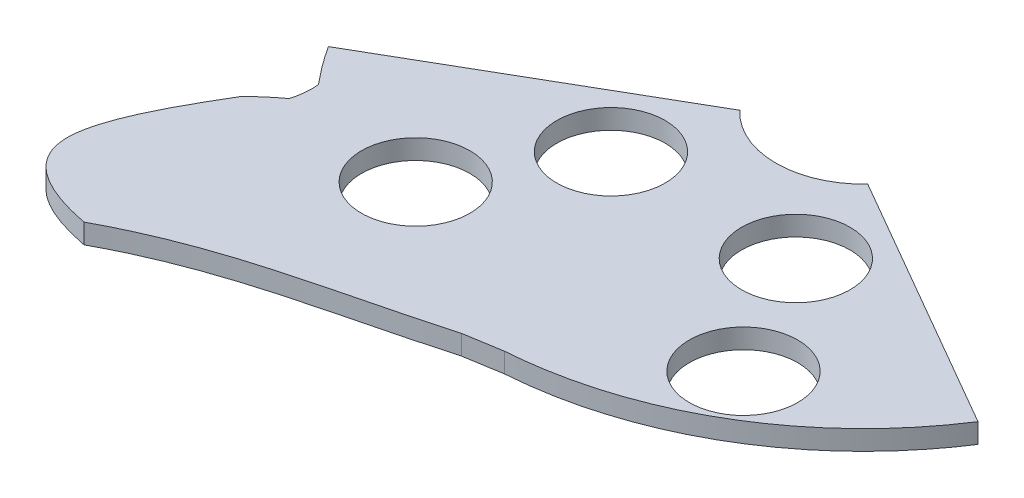
ISO-10303-21;
HEADER;
FILE_DESCRIPTION(('STEP AP214'),'2;1');
FILE_NAME('part.step','',(''),(''),'','','');
FILE_SCHEMA(('AUTOMOTIVE_DESIGN { 1 0 10303 214 1 1 1 1 }'));
ENDSEC;
DATA;
#1=APPLICATION_CONTEXT('core data for automotive mechanical design processes');
#2=APPLICATION_PROTOCOL_DEFINITION('international standard','automotive_design',2000,#1);
#3=PRODUCT_CONTEXT('',#1,'mechanical');
#4=PRODUCT('Part','Part','',(#3));
#5=PRODUCT_RELATED_PRODUCT_CATEGORY('part','',(#4));
#6=PRODUCT_DEFINITION_FORMATION('','',#4);
#7=PRODUCT_DEFINITION_CONTEXT('part definition',#1,'design');
#8=PRODUCT_DEFINITION('design','',#6,#7);
#9=PRODUCT_DEFINITION_SHAPE('','',#8);
#10=(LENGTH_UNIT() NAMED_UNIT(*) SI_UNIT(.MILLI.,.METRE.));
#11=(NAMED_UNIT(*) PLANE_ANGLE_UNIT() SI_UNIT($,.RADIAN.));
#12=(NAMED_UNIT(*) SI_UNIT($,.STERADIAN.) SOLID_ANGLE_UNIT());
#13=UNCERTAINTY_MEASURE_WITH_UNIT(LENGTH_MEASURE(1.E-05),#10,'distance_accuracy_value','');
#14=(GEOMETRIC_REPRESENTATION_CONTEXT(3) GLOBAL_UNCERTAINTY_ASSIGNED_CONTEXT((#13)) GLOBAL_UNIT_ASSIGNED_CONTEXT((#10,
#11,#12)) REPRESENTATION_CONTEXT('',''));
#15=CARTESIAN_POINT('',(0.,0.,0.));
#16=DIRECTION('',(0.,0.,1.));
#17=DIRECTION('',(1.,0.,0.));
#18=AXIS2_PLACEMENT_3D('',#15,#16,#17);
#19=CARTESIAN_POINT('',(-31.5137720928443,-111.736,87.2558514962642));
#20=DIRECTION('',(0.,1.,0.));
#21=DIRECTION('',(0.,0.,1.));
#22=AXIS2_PLACEMENT_3D('',#19,#20,#21);
#23=PLANE('',#22);
#24=CARTESIAN_POINT('',(18.75,-111.736,32.476));
#25=DIRECTION('',(0.,-1.,0.));
#26=DIRECTION('',(0.,0.,-1.));
#27=AXIS2_PLACEMENT_3D('',#24,#25,#26);
#28=CIRCLE('',#27,10.999845998306);
#29=CARTESIAN_POINT('',(18.75,-111.736,21.476154001694));
#30=VERTEX_POINT('',#29);
#31=EDGE_CURVE('E445',#30,#30,#28,.T.);
#32=ORIENTED_EDGE('',*,*,#31,.F.);
#33=EDGE_LOOP('',(#32));
#34=FACE_BOUND('',#33,.T.);
#35=CARTESIAN_POINT('',(-33.25,-111.736,57.591));
#36=DIRECTION('',(0.,-1.,0.));
#37=DIRECTION('',(0.,0.,-1.));
#38=AXIS2_PLACEMENT_3D('',#35,#36,#37);
#39=CIRCLE('',#38,10.999845998306);
#40=CARTESIAN_POINT('',(-33.25,-111.736,46.591154001694));
#41=VERTEX_POINT('',#40);
#42=EDGE_CURVE('E428',#41,#41,#39,.T.);
#43=ORIENTED_EDGE('',*,*,#42,.F.);
#44=EDGE_LOOP('',(#43));
#45=FACE_BOUND('',#44,.T.);
#46=CARTESIAN_POINT('',(-2.03178119647454,-111.736,79.545679459973));
#47=CARTESIAN_POINT('',(-2.21748719741889,-111.736,79.5981103006328));
#48=CARTESIAN_POINT('',(-5.88441218076331,-111.736,80.6334024211648));
#49=CARTESIAN_POINT('',(-13.0706280805937,-111.736,82.5176595693309));
#50=CARTESIAN_POINT('',(-21.8487370086499,-111.736,84.6919168837417));
#51=CARTESIAN_POINT('',(-28.8502610507126,-111.736,86.5095735267082));
#52=CARTESIAN_POINT('',(-35.8613399062389,-111.736,88.4602520867528));
#53=CARTESIAN_POINT('',(-44.4693251160133,-111.736,91.2316574917693));
#54=CARTESIAN_POINT('',(-51.7866983168984,-111.736,94.2596685314863));
#55=CARTESIAN_POINT('',(-56.2223618589842,-111.736,96.4025313891803));
#56=CARTESIAN_POINT('',(-58.0469637209967,-111.736,97.3224530072907));
#57=CARTESIAN_POINT('',(-59.252016923761,-111.736,97.9655333368525));
#58=CARTESIAN_POINT('',(-59.8561994001059,-111.736,98.2879571643748));
#59=B_SPLINE_CURVE_WITH_KNOTS('',3,(#46,#47,#48,#49,#50,#51,#52,#53,#54,#55,#56,#57,#58),
.UNSPECIFIED.,.F.,.F.,(4,1,1,1,1,1,1,1,1,1,4),(0.,0.00949811358191713,0.187548435759016,
0.365628289866562,0.454638288573253,0.543587017399176,0.723822200410255,0.899429959715416,
0.932769275994163,0.966292255625618,1.),.UNSPECIFIED.);
#60=CARTESIAN_POINT('',(-2.0317801757311,-111.736,79.5456855393009));
#61=VERTEX_POINT('',#60);
#62=CARTESIAN_POINT('',(-59.8559890898672,-111.736,98.2878449316723));
#63=VERTEX_POINT('',#62);
#64=EDGE_CURVE('E401',#61,#63,#59,.T.);
#65=ORIENTED_EDGE('',*,*,#64,.T.);
#66=DIRECTION('',(-0.994721215485722,0.,0.102614343357094));
#67=VECTOR('',#66,1.);
#68=CARTESIAN_POINT('',(-59.8559890898672,-111.736,98.2878449316723));
#69=LINE('',#68,#67);
#70=CARTESIAN_POINT('',(-59.8565013834733,-111.736,98.2878977793156));
#71=VERTEX_POINT('',#70);
#72=EDGE_CURVE('E107',#63,#71,#69,.T.);
#73=ORIENTED_EDGE('',*,*,#72,.T.);
#74=CARTESIAN_POINT('',(-59.8565013834733,-111.736,98.2878977793156));
#75=CARTESIAN_POINT('',(-69.5300759499468,-111.736,96.3855636719906));
#76=CARTESIAN_POINT('',(-82.0104942647189,-111.736,89.2819037680634));
#77=CARTESIAN_POINT('',(-71.8491297807287,-111.736,70.0999187205672));
#78=CARTESIAN_POINT('',(-65.949111027132,-111.736,60.2198328441974));
#79=B_SPLINE_CURVE_WITH_KNOTS('',3,(#74,#75,#76,#77,#78),.UNSPECIFIED.,.F.,.F.,(4,1,4),(0.,
0.510753583597468,0.999999863466676),.UNSPECIFIED.);
#80=CARTESIAN_POINT('',(-65.949111027132,-111.736,60.2198328441974));
#81=VERTEX_POINT('',#80);
#82=EDGE_CURVE('E399',#71,#81,#79,.T.);
#83=ORIENTED_EDGE('',*,*,#82,.T.);
#84=CARTESIAN_POINT('',(-60.7670507231847,-111.736,55.7993207475516));
#85=CARTESIAN_POINT('',(-61.1099981350749,-111.736,56.0543698082114));
#86=CARTESIAN_POINT('',(-61.7971175607158,-111.736,56.5653786626155));
#87=CARTESIAN_POINT('',(-62.8018008501687,-111.736,57.3701561377738));
#88=CARTESIAN_POINT('',(-63.7891526191819,-111.736,58.2046519762193));
#89=CARTESIAN_POINT('',(-64.756712262598,-111.736,59.0721119376626));
#90=CARTESIAN_POINT('',(-65.4723523378211,-111.736,59.7498811111553));
#91=CARTESIAN_POINT('',(-65.8658361237893,-111.736,60.1377497125325));
#92=CARTESIAN_POINT('',(-65.9491159666621,-111.736,60.2198411158632));
#93=B_SPLINE_CURVE_WITH_KNOTS('',3,(#84,#85,#86,#87,#88,#89,#90,#91,#92),.UNSPECIFIED.,.F.,.F.,
(4,1,1,1,1,1,4),(0.,0.188058136499834,0.376787793868092,0.566339482208077,0.756870107881908,
0.94854217648776,1.),.UNSPECIFIED.);
#94=CARTESIAN_POINT('',(-60.7670507231847,-111.736,55.7993207475516));
#95=VERTEX_POINT('',#94);
#96=EDGE_CURVE('E336',#81,#95,#93,.F.);
#97=ORIENTED_EDGE('',*,*,#96,.T.);
#98=CARTESIAN_POINT('',(-60.2526206276826,-111.736,50.3181152033262));
#99=CARTESIAN_POINT('',(-60.240013672135,-111.736,50.4081722730157));
#100=CARTESIAN_POINT('',(-60.2147906237152,-111.736,50.5883516843542));
#101=CARTESIAN_POINT('',(-60.1866124812174,-111.736,50.8599689495696));
#102=CARTESIAN_POINT('',(-60.165372634796,-111.736,51.13249486048));
#103=CARTESIAN_POINT('',(-60.1516800941592,-111.736,51.4059442823338));
#104=CARTESIAN_POINT('',(-60.1419651042944,-111.736,51.8168549668867));
#105=CARTESIAN_POINT('',(-60.1541756677885,-111.736,52.3769119912213));
#106=CARTESIAN_POINT('',(-60.2096955753526,-111.736,53.0783120507864));
#107=CARTESIAN_POINT('',(-60.2981504307189,-111.736,53.7817567736869));
#108=CARTESIAN_POINT('',(-60.3962077373735,-111.736,54.3632771993052));
#109=CARTESIAN_POINT('',(-60.4903974136492,-111.736,54.8216435952897));
#110=CARTESIAN_POINT('',(-60.5707429074705,-111.736,55.1589713768373));
#111=CARTESIAN_POINT('',(-60.6603563375182,-111.736,55.4833107698183));
#112=CARTESIAN_POINT('',(-60.7317267183386,-111.736,55.6946948171803));
#113=CARTESIAN_POINT('',(-60.7670516250781,-111.736,55.7993197564541));
#114=B_SPLINE_CURVE_WITH_KNOTS('',3,(#98,#99,#100,#101,#102,#103,#104,#105,#106,#107,#108,#109,
#110,#111,#112,#113),.UNSPECIFIED.,.F.,.F.,(4,1,1,1,1,1,1,1,1,1,1,1,1,4),(0.,0.0491530891513535,
0.09834180369512,0.147585269600685,0.196903783628035,0.24632380770677,0.369750821215096,
0.499511892559201,0.626495621441943,0.752891677292637,0.818190860638879,0.879415953268396,
0.940316695019687,1.),.UNSPECIFIED.);
#115=CARTESIAN_POINT('',(-60.2526206276826,-111.736,50.3181152033262));
#116=VERTEX_POINT('',#115);
#117=EDGE_CURVE('E395',#95,#116,#114,.F.);
#118=ORIENTED_EDGE('',*,*,#117,.T.);
#119=CARTESIAN_POINT('',(-65.8942438215736,-111.736,42.6629141284688));
#120=CARTESIAN_POINT('',(-64.1696780269507,-111.736,45.3256104245312));
#121=CARTESIAN_POINT('',(-62.2853732618695,-111.736,47.8843448713594));
#122=CARTESIAN_POINT('',(-60.2526206276826,-111.736,50.3181152033262));
#123=B_SPLINE_CURVE_WITH_KNOTS('',3,(#119,#120,#121,#122),.UNSPECIFIED.,.F.,.F.,(4,4),
(1.81743509131138E-13,0.999998564583058),.UNSPECIFIED.);
#124=CARTESIAN_POINT('',(-65.8942438215736,-111.736,42.6629141284688));
#125=VERTEX_POINT('',#124);
#126=EDGE_CURVE('E385',#116,#125,#123,.F.);
#127=ORIENTED_EDGE('',*,*,#126,.T.);
#128=DIRECTION('',(0.866025113443951,0.,-0.500000502884138));
#129=VECTOR('',#128,1.);
#130=CARTESIAN_POINT('',(-65.8942438215736,-111.736,42.6629141284688));
#131=LINE('',#130,#129);
#132=CARTESIAN_POINT('',(-12.9766531358799,-111.736,12.1108879302399));
#133=VERTEX_POINT('',#132);
#134=EDGE_CURVE('E394',#125,#133,#131,.T.);
#135=ORIENTED_EDGE('',*,*,#134,.T.);
#136=CARTESIAN_POINT('',(0.,-111.736,0.));
#137=DIRECTION('',(0.,1.,0.));
#138=DIRECTION('',(0.,0.,-1.));
#139=AXIS2_PLACEMENT_3D('',#136,#137,#138);
#140=CIRCLE('',#139,17.7501305084715);
#141=CARTESIAN_POINT('',(12.9766531358511,-111.736,12.1108879302707));
#142=VERTEX_POINT('',#141);
#143=EDGE_CURVE('E136',#133,#142,#140,.T.);
#144=ORIENTED_EDGE('',*,*,#143,.T.);
#145=DIRECTION('',(0.866025113442765,0.,0.500000502886192));
#146=VECTOR('',#145,1.);
#147=CARTESIAN_POINT('',(12.9766531358511,-111.736,12.1108879302707));
#148=LINE('',#147,#146);
#149=CARTESIAN_POINT('',(65.8946490574718,-111.736,42.6631480920524));
#150=VERTEX_POINT('',#149);
#151=EDGE_CURVE('E129',#142,#150,#148,.T.);
#152=ORIENTED_EDGE('',*,*,#151,.T.);
#153=CARTESIAN_POINT('',(5.52704089744945,-111.736,78.3050874040574));
#154=CARTESIAN_POINT('',(11.5671819822808,-111.736,77.8791631517755));
#155=CARTESIAN_POINT('',(17.5586468518557,-111.736,76.7503090830939));
#156=CARTESIAN_POINT('',(26.2325125491048,-111.736,74.0494180871268));
#157=CARTESIAN_POINT('',(29.0718398585422,-111.736,72.9819509063682));
#158=CARTESIAN_POINT('',(34.6059021480598,-111.736,70.5261180104147));
#159=CARTESIAN_POINT('',(37.3024970235499,-111.736,69.1359535186607));
#160=CARTESIAN_POINT('',(42.5192804826308,-111.736,66.0571331421244));
#161=CARTESIAN_POINT('',(45.0347562929905,-111.736,64.3680386555226));
#162=CARTESIAN_POINT('',(49.8608823302316,-111.736,60.7056225959295));
#163=CARTESIAN_POINT('',(52.1675481057686,-111.736,58.7366662481767));
#164=CARTESIAN_POINT('',(58.722327918449,-111.736,52.4479584795638));
#165=CARTESIAN_POINT('',(62.6034361641309,-111.736,47.746985020835));
#166=CARTESIAN_POINT('',(65.8946490574718,-111.736,42.6631480920524));
#167=B_SPLINE_CURVE_WITH_KNOTS('',3,(#153,#154,#155,#156,#157,#158,#159,#160,#161,#162,#163,
#164,#165,#166),.UNSPECIFIED.,.F.,.F.,(4,2,2,2,2,2,4),(0.,0.25,0.375,0.5,0.625,0.75,1.),.UNSPECIFIED.);
#168=CARTESIAN_POINT('',(5.52704089744945,-111.736,78.3050874040574));
#169=VERTEX_POINT('',#168);
#170=EDGE_CURVE('E133',#150,#169,#167,.F.);
#171=ORIENTED_EDGE('',*,*,#170,.T.);
#172=CARTESIAN_POINT('',(-2.0317801757311,-111.736,79.5456855393009));
#173=CARTESIAN_POINT('',(-1.59270046414319,-111.736,79.4719511090066));
#174=CARTESIAN_POINT('',(-0.733887670399957,-111.736,79.3277311547602));
#175=CARTESIAN_POINT('',(0.52513174468168,-111.736,79.1128514670757));
#176=CARTESIAN_POINT('',(1.98831347075927,-111.736,78.8645614680926));
#177=CARTESIAN_POINT('',(3.34288699807821,-111.736,78.6397954193356));
#178=CARTESIAN_POINT('',(4.60354458962283,-111.736,78.4414405576808));
#179=CARTESIAN_POINT('',(5.22090180351672,-111.736,78.350288394329));
#180=CARTESIAN_POINT('',(5.52704087754652,-111.736,78.3050872692584));
#181=B_SPLINE_CURVE_WITH_KNOTS('',3,(#172,#173,#174,#175,#176,#177,#178,#179,#180),
.UNSPECIFIED.,.F.,.F.,(4,1,1,1,1,1,4),(-12.4185120707704,-12.2441428028977,-12.077456556072,
-11.9182991999344,-11.6629087977526,-11.5397022893786,-11.4185065052654),.UNSPECIFIED.);
#182=EDGE_CURVE('E52',#169,#61,#181,.F.);
#183=ORIENTED_EDGE('',*,*,#182,.T.);
#184=EDGE_LOOP('',(#65,#73,#83,#97,#118,#127,#135,#144,#152,#171,#183));
#185=FACE_BOUND('',#184,.T.);
#186=CARTESIAN_POINT('',(33.25,-111.736,57.591));
#187=DIRECTION('',(0.,-1.,0.));
#188=DIRECTION('',(0.,0.,-1.));
#189=AXIS2_PLACEMENT_3D('',#186,#187,#188);
#190=CIRCLE('',#189,10.999845998306);
#191=CARTESIAN_POINT('',(33.25,-111.736,46.591154001694));
#192=VERTEX_POINT('',#191);
#193=EDGE_CURVE('E440',#192,#192,#190,.T.);
#194=ORIENTED_EDGE('',*,*,#193,.F.);
#195=EDGE_LOOP('',(#194));
#196=FACE_BOUND('',#195,.T.);
#197=CARTESIAN_POINT('',(-18.75,-111.736,32.476));
#198=DIRECTION('',(0.,-1.,0.));
#199=DIRECTION('',(0.,0.,-1.));
#200=AXIS2_PLACEMENT_3D('',#197,#198,#199);
#201=CIRCLE('',#200,10.999845998306);
#202=CARTESIAN_POINT('',(-18.75,-111.736,21.476154001694));
#203=VERTEX_POINT('',#202);
#204=EDGE_CURVE('E451',#203,#203,#201,.T.);
#205=ORIENTED_EDGE('',*,*,#204,.F.);
#206=EDGE_LOOP('',(#205));
#207=FACE_BOUND('',#206,.T.);
#208=ADVANCED_FACE('F30',(#34,#45,#185,#196,#207),#23,.F.);
#209=CARTESIAN_POINT('',(-31.5137720928443,-107.736,87.2558514962642));
#210=DIRECTION('',(0.,1.,0.));
#211=DIRECTION('',(0.,0.,1.));
#212=AXIS2_PLACEMENT_3D('',#209,#210,#211);
#213=PLANE('',#212);
#214=CARTESIAN_POINT('',(18.75,-107.736,32.476));
#215=DIRECTION('',(0.,-1.,0.));
#216=DIRECTION('',(0.,0.,-1.));
#217=AXIS2_PLACEMENT_3D('',#214,#215,#216);
#218=CIRCLE('',#217,10.999845998306);
#219=CARTESIAN_POINT('',(18.75,-107.736,21.476154001694));
#220=VERTEX_POINT('',#219);
#221=EDGE_CURVE('E448',#220,#220,#218,.T.);
#222=ORIENTED_EDGE('',*,*,#221,.T.);
#223=EDGE_LOOP('',(#222));
#224=FACE_BOUND('',#223,.T.);
#225=CARTESIAN_POINT('',(-33.25,-107.736,57.591));
#226=DIRECTION('',(0.,-1.,0.));
#227=DIRECTION('',(0.,0.,-1.));
#228=AXIS2_PLACEMENT_3D('',#225,#226,#227);
#229=CIRCLE('',#228,10.999845998306);
#230=CARTESIAN_POINT('',(-33.25,-107.736,46.591154001694));
#231=VERTEX_POINT('',#230);
#232=EDGE_CURVE('E407',#231,#231,#229,.T.);
#233=ORIENTED_EDGE('',*,*,#232,.T.);
#234=EDGE_LOOP('',(#233));
#235=FACE_BOUND('',#234,.T.);
#236=CARTESIAN_POINT('',(-2.03178119647454,-107.736,79.545679459973));
#237=CARTESIAN_POINT('',(-2.21748719741889,-107.736,79.5981103006328));
#238=CARTESIAN_POINT('',(-5.88441218076331,-107.736,80.6334024211648));
#239=CARTESIAN_POINT('',(-13.0706280805937,-107.736,82.5176595693309));
#240=CARTESIAN_POINT('',(-21.8487370086499,-107.736,84.6919168837417));
#241=CARTESIAN_POINT('',(-28.8502610507126,-107.736,86.5095735267082));
#242=CARTESIAN_POINT('',(-35.8613399062389,-107.736,88.4602520867528));
#243=CARTESIAN_POINT('',(-44.4693251160133,-107.736,91.2316574917693));
#244=CARTESIAN_POINT('',(-51.7866983168984,-107.736,94.2596685314863));
#245=CARTESIAN_POINT('',(-56.2223618589842,-107.736,96.4025313891803));
#246=CARTESIAN_POINT('',(-58.0469637209967,-107.736,97.3224530072907));
#247=CARTESIAN_POINT('',(-59.252016923761,-107.736,97.9655333368525));
#248=CARTESIAN_POINT('',(-59.8561994001059,-107.736,98.2879571643748));
#249=B_SPLINE_CURVE_WITH_KNOTS('',3,(#236,#237,#238,#239,#240,#241,#242,#243,#244,#245,#246,
#247,#248),.UNSPECIFIED.,.F.,.F.,(4,1,1,1,1,1,1,1,1,1,4),(0.,0.00949811358191713,
0.187548435759016,0.365628289866562,0.454638288573253,0.543587017399176,0.723822200410255,
0.899429959715416,0.932769275994163,0.966292255625618,1.),.UNSPECIFIED.);
#250=CARTESIAN_POINT('',(-2.0317801757311,-107.736,79.5456855393009));
#251=VERTEX_POINT('',#250);
#252=CARTESIAN_POINT('',(-59.8559890898672,-107.736,98.2878449316723));
#253=VERTEX_POINT('',#252);
#254=EDGE_CURVE('E192',#251,#253,#249,.T.);
#255=ORIENTED_EDGE('',*,*,#254,.F.);
#256=CARTESIAN_POINT('',(5.5270408774408,-107.736,78.305087269274));
#257=CARTESIAN_POINT('',(5.22090180344624,-107.736,78.3502883943394));
#258=CARTESIAN_POINT('',(4.60354458958764,-107.736,78.4414405576863));
#259=CARTESIAN_POINT('',(3.34288699807821,-107.736,78.6397954193356));
#260=CARTESIAN_POINT('',(1.98831347075927,-107.736,78.8645614680926));
#261=CARTESIAN_POINT('',(0.52513174468168,-107.736,79.1128514670757));
#262=CARTESIAN_POINT('',(-0.733887670399957,-107.736,79.3277311547602));
#263=CARTESIAN_POINT('',(-1.59270046414319,-107.736,79.4719511090066));
#264=CARTESIAN_POINT('',(-2.0317801757311,-107.736,79.5456855393009));
#265=B_SPLINE_CURVE_WITH_KNOTS('',3,(#256,#257,#258,#259,#260,#261,#262,#263,#264),
.UNSPECIFIED.,.F.,.F.,(4,1,1,1,1,1,4),(-12.4185120707564,-12.2973162866572,-12.1741097782831,
-11.9187193761013,-11.7595620199638,-11.5928757731381,-11.4185065052654),.UNSPECIFIED.);
#266=CARTESIAN_POINT('',(5.52704089744945,-107.736,78.3050874040574));
#267=VERTEX_POINT('',#266);
#268=EDGE_CURVE('E98',#267,#251,#265,.T.);
#269=ORIENTED_EDGE('',*,*,#268,.F.);
#270=CARTESIAN_POINT('',(65.8946490574718,-107.736,42.6631480920524));
#271=CARTESIAN_POINT('',(62.6034361641309,-107.736,47.746985020835));
#272=CARTESIAN_POINT('',(58.722327918449,-107.736,52.4479584795638));
#273=CARTESIAN_POINT('',(52.1675481057686,-107.736,58.7366662481767));
#274=CARTESIAN_POINT('',(49.8608823302316,-107.736,60.7056225959295));
#275=CARTESIAN_POINT('',(45.0347562929905,-107.736,64.3680386555226));
#276=CARTESIAN_POINT('',(42.5192804826308,-107.736,66.0571331421244));
#277=CARTESIAN_POINT('',(37.3024970235499,-107.736,69.1359535186607));
#278=CARTESIAN_POINT('',(34.6059021480598,-107.736,70.5261180104147));
#279=CARTESIAN_POINT('',(29.0718398585422,-107.736,72.9819509063682));
#280=CARTESIAN_POINT('',(26.2325125491048,-107.736,74.0494180871268));
#281=CARTESIAN_POINT('',(17.5586468518557,-107.736,76.7503090830939));
#282=CARTESIAN_POINT('',(11.5671819822808,-107.736,77.8791631517755));
#283=CARTESIAN_POINT('',(5.52704089744945,-107.736,78.3050874040574));
#284=B_SPLINE_CURVE_WITH_KNOTS('',3,(#270,#271,#272,#273,#274,#275,#276,#277,#278,#279,#280,
#281,#282,#283),.UNSPECIFIED.,.F.,.F.,(4,2,2,2,2,2,4),(0.,0.25,0.375,0.5,0.625,0.75,1.),.UNSPECIFIED.);
#285=CARTESIAN_POINT('',(65.8946490574718,-107.736,42.6631480920524));
#286=VERTEX_POINT('',#285);
#287=EDGE_CURVE('E91',#286,#267,#284,.T.);
#288=ORIENTED_EDGE('',*,*,#287,.F.);
#289=DIRECTION('',(0.866025113442765,0.,0.500000502886192));
#290=VECTOR('',#289,1.);
#291=CARTESIAN_POINT('',(12.9766531358511,-107.736,12.1108879302707));
#292=LINE('',#291,#290);
#293=CARTESIAN_POINT('',(12.9766531358511,-107.736,12.1108879302707));
#294=VERTEX_POINT('',#293);
#295=EDGE_CURVE('E144',#294,#286,#292,.T.);
#296=ORIENTED_EDGE('',*,*,#295,.F.);
#297=CARTESIAN_POINT('',(0.,-107.736,0.));
#298=DIRECTION('',(0.,1.,0.));
#299=DIRECTION('',(0.,0.,-1.));
#300=AXIS2_PLACEMENT_3D('',#297,#298,#299);
#301=CIRCLE('',#300,17.7501305084715);
#302=CARTESIAN_POINT('',(-12.9766531358799,-107.736,12.1108879302399));
#303=VERTEX_POINT('',#302);
#304=EDGE_CURVE('E199',#303,#294,#301,.T.);
#305=ORIENTED_EDGE('',*,*,#304,.F.);
#306=DIRECTION('',(0.866025113443951,0.,-0.500000502884138));
#307=VECTOR('',#306,1.);
#308=CARTESIAN_POINT('',(-65.8942438215736,-107.736,42.6629141284688));
#309=LINE('',#308,#307);
#310=CARTESIAN_POINT('',(-65.8942438215736,-107.736,42.6629141284688));
#311=VERTEX_POINT('',#310);
#312=EDGE_CURVE('E204',#311,#303,#309,.T.);
#313=ORIENTED_EDGE('',*,*,#312,.F.);
#314=CARTESIAN_POINT('',(-60.2526206276826,-107.736,50.3181152033262));
#315=CARTESIAN_POINT('',(-62.2853732618695,-107.736,47.8843448713594));
#316=CARTESIAN_POINT('',(-64.1696780269507,-107.736,45.3256104245312));
#317=CARTESIAN_POINT('',(-65.8942438215736,-107.736,42.6629141284688));
#318=B_SPLINE_CURVE_WITH_KNOTS('',3,(#314,#315,#316,#317),.UNSPECIFIED.,.F.,.F.,(4,4),
(1.81750624711441E-13,0.999998564583058),.UNSPECIFIED.);
#319=CARTESIAN_POINT('',(-60.2526206276826,-107.736,50.3181152033262));
#320=VERTEX_POINT('',#319);
#321=EDGE_CURVE('E294',#320,#311,#318,.T.);
#322=ORIENTED_EDGE('',*,*,#321,.F.);
#323=CARTESIAN_POINT('',(-60.7670516250781,-107.736,55.7993197564541));
#324=CARTESIAN_POINT('',(-60.7317267183386,-107.736,55.6946948171803));
#325=CARTESIAN_POINT('',(-60.6603563375182,-107.736,55.4833107698183));
#326=CARTESIAN_POINT('',(-60.5707429074705,-107.736,55.1589713768373));
#327=CARTESIAN_POINT('',(-60.4903974136492,-107.736,54.8216435952897));
#328=CARTESIAN_POINT('',(-60.3962077373735,-107.736,54.3632771993052));
#329=CARTESIAN_POINT('',(-60.2981504307189,-107.736,53.7817567736869));
#330=CARTESIAN_POINT('',(-60.2096955753526,-107.736,53.0783120507864));
#331=CARTESIAN_POINT('',(-60.1541756677885,-107.736,52.3769119912213));
#332=CARTESIAN_POINT('',(-60.1419651042944,-107.736,51.8168549668867));
#333=CARTESIAN_POINT('',(-60.1516800941592,-107.736,51.4059442823338));
#334=CARTESIAN_POINT('',(-60.165372634796,-107.736,51.13249486048));
#335=CARTESIAN_POINT('',(-60.1866124812174,-107.736,50.8599689495696));
#336=CARTESIAN_POINT('',(-60.2147906237152,-107.736,50.5883516843542));
#337=CARTESIAN_POINT('',(-60.240013672135,-107.736,50.4081722730157));
#338=CARTESIAN_POINT('',(-60.2526206276826,-107.736,50.3181152033262));
#339=B_SPLINE_CURVE_WITH_KNOTS('',3,(#323,#324,#325,#326,#327,#328,#329,#330,#331,#332,#333,
#334,#335,#336,#337,#338),.UNSPECIFIED.,.F.,.F.,(4,1,1,1,1,1,1,1,1,1,1,1,1,4),(0.,
0.0596833049803134,0.120584046731604,0.181809139361121,0.247108322707363,0.373504378558057,
0.500488107440799,0.630249178784904,0.75367619229323,0.803096216371965,0.852414730399315,
0.90165819630488,0.950846910848646,1.),.UNSPECIFIED.);
#340=CARTESIAN_POINT('',(-60.7670507231847,-107.736,55.7993207475516));
#341=VERTEX_POINT('',#340);
#342=EDGE_CURVE('E367',#341,#320,#339,.T.);
#343=ORIENTED_EDGE('',*,*,#342,.F.);
#344=CARTESIAN_POINT('',(-65.9491159666621,-107.736,60.2198411158632));
#345=CARTESIAN_POINT('',(-65.8658361237893,-107.736,60.1377497125325));
#346=CARTESIAN_POINT('',(-65.4723523378211,-107.736,59.7498811111553));
#347=CARTESIAN_POINT('',(-64.756712262598,-107.736,59.0721119376626));
#348=CARTESIAN_POINT('',(-63.7891526191819,-107.736,58.2046519762193));
#349=CARTESIAN_POINT('',(-62.8018008501687,-107.736,57.3701561377738));
#350=CARTESIAN_POINT('',(-61.7971175607158,-107.736,56.5653786626155));
#351=CARTESIAN_POINT('',(-61.1099981350749,-107.736,56.0543698082114));
#352=CARTESIAN_POINT('',(-60.7670507231847,-107.736,55.7993207475516));
#353=B_SPLINE_CURVE_WITH_KNOTS('',3,(#344,#345,#346,#347,#348,#349,#350,#351,#352),
.UNSPECIFIED.,.F.,.F.,(4,1,1,1,1,1,4),(0.,0.0514578235122405,0.243129892118092,
0.433660517791923,0.623212206131908,0.811941863500166,1.),.UNSPECIFIED.);
#354=CARTESIAN_POINT('',(-65.949111027132,-107.736,60.2198328441974));
#355=VERTEX_POINT('',#354);
#356=EDGE_CURVE('E194',#355,#341,#353,.T.);
#357=ORIENTED_EDGE('',*,*,#356,.F.);
#358=CARTESIAN_POINT('',(-59.8565013834733,-107.736,98.2878977793156));
#359=CARTESIAN_POINT('',(-69.5300759499468,-107.736,96.3855636719906));
#360=CARTESIAN_POINT('',(-82.0104942647189,-107.736,89.2819037680634));
#361=CARTESIAN_POINT('',(-71.8491297807287,-107.736,70.0999187205672));
#362=CARTESIAN_POINT('',(-65.949111027132,-107.736,60.2198328441974));
#363=B_SPLINE_CURVE_WITH_KNOTS('',3,(#358,#359,#360,#361,#362),.UNSPECIFIED.,.F.,.F.,(4,1,4),
(0.,0.510753583597468,0.999999863466676),.UNSPECIFIED.);
#364=CARTESIAN_POINT('',(-59.8565013834733,-107.736,98.2878977793156));
#365=VERTEX_POINT('',#364);
#366=EDGE_CURVE('E191',#365,#355,#363,.T.);
#367=ORIENTED_EDGE('',*,*,#366,.F.);
#368=DIRECTION('',(-0.994721215485722,0.,0.102614343357094));
#369=VECTOR('',#368,1.);
#370=CARTESIAN_POINT('',(-59.8559890898672,-107.736,98.2878449316723));
#371=LINE('',#370,#369);
#372=EDGE_CURVE('E186',#253,#365,#371,.T.);
#373=ORIENTED_EDGE('',*,*,#372,.F.);
#374=EDGE_LOOP('',(#255,#269,#288,#296,#305,#313,#322,#343,#357,#367,#373));
#375=FACE_BOUND('',#374,.T.);
#376=CARTESIAN_POINT('',(33.25,-107.736,57.591));
#377=DIRECTION('',(0.,-1.,0.));
#378=DIRECTION('',(0.,0.,-1.));
#379=AXIS2_PLACEMENT_3D('',#376,#377,#378);
#380=CIRCLE('',#379,10.999845998306);
#381=CARTESIAN_POINT('',(33.25,-107.736,46.591154001694));
#382=VERTEX_POINT('',#381);
#383=EDGE_CURVE('E442',#382,#382,#380,.T.);
#384=ORIENTED_EDGE('',*,*,#383,.T.);
#385=EDGE_LOOP('',(#384));
#386=FACE_BOUND('',#385,.T.);
#387=CARTESIAN_POINT('',(-18.75,-107.736,32.476));
#388=DIRECTION('',(0.,-1.,0.));
#389=DIRECTION('',(0.,0.,-1.));
#390=AXIS2_PLACEMENT_3D('',#387,#388,#389);
#391=CIRCLE('',#390,10.999845998306);
#392=CARTESIAN_POINT('',(-18.75,-107.736,21.476154001694));
#393=VERTEX_POINT('',#392);
#394=EDGE_CURVE('E454',#393,#393,#391,.T.);
#395=ORIENTED_EDGE('',*,*,#394,.T.);
#396=EDGE_LOOP('',(#395));
#397=FACE_BOUND('',#396,.T.);
#398=ADVANCED_FACE('F299',(#224,#235,#375,#386,#397),#213,.T.);
#399=DIRECTION('',(0.,1.,0.));
#400=VECTOR('',#399,1.);
#401=SURFACE_OF_LINEAR_EXTRUSION('',#59,#400);
#402=ORIENTED_EDGE('',*,*,#254,.T.);
#403=DIRECTION('',(0.,1.,0.));
#404=VECTOR('',#403,1.);
#405=CARTESIAN_POINT('',(-59.8559890898672,-111.736,98.2878449316723));
#406=LINE('',#405,#404);
#407=EDGE_CURVE('E11',#63,#253,#406,.T.);
#408=ORIENTED_EDGE('',*,*,#407,.F.);
#409=ORIENTED_EDGE('',*,*,#64,.F.);
#410=DIRECTION('',(0.,1.,0.));
#411=VECTOR('',#410,1.);
#412=CARTESIAN_POINT('',(-2.0317801757311,-111.736,79.5456855393009));
#413=LINE('',#412,#411);
#414=EDGE_CURVE('E631',#61,#251,#413,.T.);
#415=ORIENTED_EDGE('',*,*,#414,.T.);
#416=EDGE_LOOP('',(#402,#408,#409,#415));
#417=FACE_BOUND('',#416,.T.);
#418=ADVANCED_FACE('F32',(#417),#401,.F.);
#419=CARTESIAN_POINT('',(-59.8559890898672,-111.736,98.2878449316723));
#420=DIRECTION('',(-0.102614343357094,0.,-0.994721215485722));
#421=DIRECTION('',(-0.994721215485722,0.,0.102614343357094));
#422=AXIS2_PLACEMENT_3D('',#419,#420,#421);
#423=PLANE('',#422);
#424=ORIENTED_EDGE('',*,*,#372,.T.);
#425=DIRECTION('',(0.,1.,0.));
#426=VECTOR('',#425,1.);
#427=CARTESIAN_POINT('',(-59.8565013834733,-111.736,98.2878977793156));
#428=LINE('',#427,#426);
#429=EDGE_CURVE('E43',#71,#365,#428,.T.);
#430=ORIENTED_EDGE('',*,*,#429,.F.);
#431=ORIENTED_EDGE('',*,*,#72,.F.);
#432=ORIENTED_EDGE('',*,*,#407,.T.);
#433=EDGE_LOOP('',(#424,#430,#431,#432));
#434=FACE_BOUND('',#433,.T.);
#435=ADVANCED_FACE('F568',(#434),#423,.F.);
#436=DIRECTION('',(0.,1.,0.));
#437=VECTOR('',#436,1.);
#438=SURFACE_OF_LINEAR_EXTRUSION('',#79,#437);
#439=ORIENTED_EDGE('',*,*,#366,.T.);
#440=CARTESIAN_POINT('',(-65.9491159666621,-111.736,60.2198411158632));
#441=DIRECTION('',(0.,1.,0.));
#442=VECTOR('',#441,1.);
#443=LINE('',#440,#442);
#444=EDGE_CURVE('E211',#81,#355,#443,.T.);
#445=ORIENTED_EDGE('',*,*,#444,.F.);
#446=ORIENTED_EDGE('',*,*,#82,.F.);
#447=ORIENTED_EDGE('',*,*,#429,.T.);
#448=EDGE_LOOP('',(#439,#445,#446,#447));
#449=FACE_BOUND('',#448,.T.);
#450=ADVANCED_FACE('F236',(#449),#438,.F.);
#451=CARTESIAN_POINT('',(-65.9491159666621,-111.736,60.2198411158632));
#452=CARTESIAN_POINT('',(-65.8658361237893,-111.736,60.1377497125325));
#453=CARTESIAN_POINT('',(-65.4723523378211,-111.736,59.7498811111553));
#454=CARTESIAN_POINT('',(-64.756712262598,-111.736,59.0721119376626));
#455=CARTESIAN_POINT('',(-63.7891526191819,-111.736,58.2046519762193));
#456=CARTESIAN_POINT('',(-62.8018008501687,-111.736,57.3701561377738));
#457=CARTESIAN_POINT('',(-61.7971175607158,-111.736,56.5653786626155));
#458=CARTESIAN_POINT('',(-61.1099981350749,-111.736,56.0543698082114));
#459=CARTESIAN_POINT('',(-60.7670507231847,-111.736,55.7993207475516));
#460=B_SPLINE_CURVE_WITH_KNOTS('',3,(#451,#452,#453,#454,#455,#456,#457,#458,#459),
.UNSPECIFIED.,.F.,.F.,(4,1,1,1,1,1,4),(0.,0.0514578235122405,0.243129892118092,
0.433660517791923,0.623212206131908,0.811941863500166,1.),.UNSPECIFIED.);
#461=DIRECTION('',(0.,1.,0.));
#462=VECTOR('',#461,1.);
#463=SURFACE_OF_LINEAR_EXTRUSION('',#460,#462);
#464=ORIENTED_EDGE('',*,*,#356,.T.);
#465=DIRECTION('',(0.,1.,0.));
#466=VECTOR('',#465,1.);
#467=CARTESIAN_POINT('',(-60.7670507231847,-111.736,55.7993207475516));
#468=LINE('',#467,#466);
#469=EDGE_CURVE('E595',#95,#341,#468,.T.);
#470=ORIENTED_EDGE('',*,*,#469,.F.);
#471=ORIENTED_EDGE('',*,*,#96,.F.);
#472=ORIENTED_EDGE('',*,*,#444,.T.);
#473=EDGE_LOOP('',(#464,#470,#471,#472));
#474=FACE_BOUND('',#473,.T.);
#475=ADVANCED_FACE('F224',(#474),#463,.F.);
#476=CARTESIAN_POINT('',(-60.7670516250781,-111.736,55.7993197564541));
#477=CARTESIAN_POINT('',(-60.7317267183386,-111.736,55.6946948171803));
#478=CARTESIAN_POINT('',(-60.6603563375182,-111.736,55.4833107698183));
#479=CARTESIAN_POINT('',(-60.5707429074705,-111.736,55.1589713768373));
#480=CARTESIAN_POINT('',(-60.4903974136492,-111.736,54.8216435952897));
#481=CARTESIAN_POINT('',(-60.3962077373735,-111.736,54.3632771993052));
#482=CARTESIAN_POINT('',(-60.2981504307189,-111.736,53.7817567736869));
#483=CARTESIAN_POINT('',(-60.2096955753526,-111.736,53.0783120507864));
#484=CARTESIAN_POINT('',(-60.1541756677885,-111.736,52.3769119912213));
#485=CARTESIAN_POINT('',(-60.1419651042944,-111.736,51.8168549668867));
#486=CARTESIAN_POINT('',(-60.1516800941592,-111.736,51.4059442823338));
#487=CARTESIAN_POINT('',(-60.165372634796,-111.736,51.13249486048));
#488=CARTESIAN_POINT('',(-60.1866124812174,-111.736,50.8599689495696));
#489=CARTESIAN_POINT('',(-60.2147906237152,-111.736,50.5883516843542));
#490=CARTESIAN_POINT('',(-60.240013672135,-111.736,50.4081722730157));
#491=CARTESIAN_POINT('',(-60.2526206276826,-111.736,50.3181152033262));
#492=B_SPLINE_CURVE_WITH_KNOTS('',3,(#476,#477,#478,#479,#480,#481,#482,#483,#484,#485,#486,
#487,#488,#489,#490,#491),.UNSPECIFIED.,.F.,.F.,(4,1,1,1,1,1,1,1,1,1,1,1,1,4),(0.,
0.0596833049803134,0.120584046731604,0.181809139361121,0.247108322707363,0.373504378558057,
0.500488107440799,0.630249178784904,0.75367619229323,0.803096216371965,0.852414730399315,
0.90165819630488,0.950846910848646,1.),.UNSPECIFIED.);
#493=DIRECTION('',(0.,1.,0.));
#494=VECTOR('',#493,1.);
#495=SURFACE_OF_LINEAR_EXTRUSION('',#492,#494);
#496=ORIENTED_EDGE('',*,*,#342,.T.);
#497=DIRECTION('',(0.,1.,0.));
#498=VECTOR('',#497,1.);
#499=CARTESIAN_POINT('',(-60.2526206276826,-111.736,50.3181152033262));
#500=LINE('',#499,#498);
#501=EDGE_CURVE('E393',#116,#320,#500,.T.);
#502=ORIENTED_EDGE('',*,*,#501,.F.);
#503=ORIENTED_EDGE('',*,*,#117,.F.);
#504=ORIENTED_EDGE('',*,*,#469,.T.);
#505=EDGE_LOOP('',(#496,#502,#503,#504));
#506=FACE_BOUND('',#505,.T.);
#507=ADVANCED_FACE('F235',(#506),#495,.F.);
#508=CARTESIAN_POINT('',(-60.2526206276826,-111.736,50.3181152033262));
#509=CARTESIAN_POINT('',(-62.2853732618695,-111.736,47.8843448713594));
#510=CARTESIAN_POINT('',(-64.1696780269507,-111.736,45.3256104245312));
#511=CARTESIAN_POINT('',(-65.8942438215736,-111.736,42.6629141284688));
#512=B_SPLINE_CURVE_WITH_KNOTS('',3,(#508,#509,#510,#511),.UNSPECIFIED.,.F.,.F.,(4,4),
(1.81750624711441E-13,0.999998564583058),.UNSPECIFIED.);
#513=DIRECTION('',(0.,1.,0.));
#514=VECTOR('',#513,1.);
#515=SURFACE_OF_LINEAR_EXTRUSION('',#512,#514);
#516=ORIENTED_EDGE('',*,*,#321,.T.);
#517=DIRECTION('',(0.,1.,0.));
#518=VECTOR('',#517,1.);
#519=CARTESIAN_POINT('',(-65.8942438215736,-111.736,42.6629141284688));
#520=LINE('',#519,#518);
#521=EDGE_CURVE('E209',#125,#311,#520,.T.);
#522=ORIENTED_EDGE('',*,*,#521,.F.);
#523=ORIENTED_EDGE('',*,*,#126,.F.);
#524=ORIENTED_EDGE('',*,*,#501,.T.);
#525=EDGE_LOOP('',(#516,#522,#523,#524));
#526=FACE_BOUND('',#525,.T.);
#527=ADVANCED_FACE('F266',(#526),#515,.F.);
#528=CARTESIAN_POINT('',(-65.8942438215736,-111.736,42.6629141284688));
#529=DIRECTION('',(0.500000502884138,0.,0.866025113443951));
#530=DIRECTION('',(0.866025113443951,0.,-0.500000502884138));
#531=AXIS2_PLACEMENT_3D('',#528,#529,#530);
#532=PLANE('',#531);
#533=ORIENTED_EDGE('',*,*,#312,.T.);
#534=DIRECTION('',(0.,1.,0.));
#535=VECTOR('',#534,1.);
#536=CARTESIAN_POINT('',(-12.9766531358799,-111.736,12.1108879302399));
#537=LINE('',#536,#535);
#538=EDGE_CURVE('E206',#133,#303,#537,.T.);
#539=ORIENTED_EDGE('',*,*,#538,.F.);
#540=ORIENTED_EDGE('',*,*,#134,.F.);
#541=ORIENTED_EDGE('',*,*,#521,.T.);
#542=EDGE_LOOP('',(#533,#539,#540,#541));
#543=FACE_BOUND('',#542,.T.);
#544=ADVANCED_FACE('F270',(#543),#532,.F.);
#545=CARTESIAN_POINT('',(0.,-111.736,0.));
#546=DIRECTION('',(0.,1.,0.));
#547=DIRECTION('',(0.,0.,1.));
#548=AXIS2_PLACEMENT_3D('',#545,#546,#547);
#549=CYLINDRICAL_SURFACE('',#548,17.7501305084715);
#550=ORIENTED_EDGE('',*,*,#304,.T.);
#551=DIRECTION('',(0.,1.,0.));
#552=VECTOR('',#551,1.);
#553=CARTESIAN_POINT('',(12.9766531358511,-111.736,12.1108879302707));
#554=LINE('',#553,#552);
#555=EDGE_CURVE('E145',#142,#294,#554,.T.);
#556=ORIENTED_EDGE('',*,*,#555,.F.);
#557=ORIENTED_EDGE('',*,*,#143,.F.);
#558=ORIENTED_EDGE('',*,*,#538,.T.);
#559=EDGE_LOOP('',(#550,#556,#557,#558));
#560=FACE_BOUND('',#559,.T.);
#561=ADVANCED_FACE('F379',(#560),#549,.F.);
#562=CARTESIAN_POINT('',(12.9766531358511,-111.736,12.1108879302707));
#563=DIRECTION('',(-0.500000502886192,0.,0.866025113442766));
#564=DIRECTION('',(0.866025113442765,0.,0.500000502886192));
#565=AXIS2_PLACEMENT_3D('',#562,#563,#564);
#566=PLANE('',#565);
#567=ORIENTED_EDGE('',*,*,#295,.T.);
#568=DIRECTION('',(0.,1.,0.));
#569=VECTOR('',#568,1.);
#570=CARTESIAN_POINT('',(65.8946490574718,-111.736,42.6631480920524));
#571=LINE('',#570,#569);
#572=EDGE_CURVE('E141',#150,#286,#571,.T.);
#573=ORIENTED_EDGE('',*,*,#572,.F.);
#574=ORIENTED_EDGE('',*,*,#151,.F.);
#575=ORIENTED_EDGE('',*,*,#555,.T.);
#576=EDGE_LOOP('',(#567,#573,#574,#575));
#577=FACE_BOUND('',#576,.T.);
#578=ADVANCED_FACE('F142',(#577),#566,.F.);
#579=CARTESIAN_POINT('',(65.8946490574718,-111.736,42.6631480920524));
#580=CARTESIAN_POINT('',(62.6034361641309,-111.736,47.746985020835));
#581=CARTESIAN_POINT('',(58.722327918449,-111.736,52.4479584795638));
#582=CARTESIAN_POINT('',(52.1675481057686,-111.736,58.7366662481767));
#583=CARTESIAN_POINT('',(49.8608823302316,-111.736,60.7056225959295));
#584=CARTESIAN_POINT('',(45.0347562929905,-111.736,64.3680386555226));
#585=CARTESIAN_POINT('',(42.5192804826308,-111.736,66.0571331421244));
#586=CARTESIAN_POINT('',(37.3024970235499,-111.736,69.1359535186607));
#587=CARTESIAN_POINT('',(34.6059021480598,-111.736,70.5261180104147));
#588=CARTESIAN_POINT('',(29.0718398585422,-111.736,72.9819509063682));
#589=CARTESIAN_POINT('',(26.2325125491048,-111.736,74.0494180871268));
#590=CARTESIAN_POINT('',(17.5586468518557,-111.736,76.7503090830939));
#591=CARTESIAN_POINT('',(11.5671819822808,-111.736,77.8791631517755));
#592=CARTESIAN_POINT('',(5.52704089744945,-111.736,78.3050874040574));
#593=B_SPLINE_CURVE_WITH_KNOTS('',3,(#579,#580,#581,#582,#583,#584,#585,#586,#587,#588,#589,
#590,#591,#592),.UNSPECIFIED.,.F.,.F.,(4,2,2,2,2,2,4),(0.,0.25,0.375,0.5,0.625,0.75,1.),.UNSPECIFIED.);
#594=DIRECTION('',(0.,1.,0.));
#595=VECTOR('',#594,1.);
#596=SURFACE_OF_LINEAR_EXTRUSION('',#593,#595);
#597=ORIENTED_EDGE('',*,*,#287,.T.);
#598=DIRECTION('',(0.,1.,0.));
#599=VECTOR('',#598,1.);
#600=CARTESIAN_POINT('',(5.52704089744945,-111.736,78.3050874040574));
#601=LINE('',#600,#599);
#602=EDGE_CURVE('E146',#169,#267,#601,.T.);
#603=ORIENTED_EDGE('',*,*,#602,.F.);
#604=ORIENTED_EDGE('',*,*,#170,.F.);
#605=ORIENTED_EDGE('',*,*,#572,.T.);
#606=EDGE_LOOP('',(#597,#603,#604,#605));
#607=FACE_BOUND('',#606,.T.);
#608=ADVANCED_FACE('F149',(#607),#596,.F.);
#609=CARTESIAN_POINT('',(-191.777319467951,-111.736,-1910.93189754596));
#610=CARTESIAN_POINT('',(75.9751667220828,-111.736,86.0607716892234));
#611=CARTESIAN_POINT('',(38.5851314682932,-111.736,73.0946969142528));
#612=CARTESIAN_POINT('',(3.34288699807821,-111.736,78.6397954193356));
#613=CARTESIAN_POINT('',(1.98831347075927,-111.736,78.8645614680926));
#614=CARTESIAN_POINT('',(0.52513174468168,-111.736,79.1128514670757));
#615=CARTESIAN_POINT('',(-65.8997842981455,-111.736,90.4497419413382));
#616=CARTESIAN_POINT('',(-134.214836404223,-111.736,88.1745214876591));
#617=CARTESIAN_POINT('',(133.737052844068,-111.736,2071.49611771593));
#618=B_SPLINE_CURVE_WITH_KNOTS('',3,(#609,#610,#611,#612,#613,#614,#615,#616,#617),
.UNSPECIFIED.,.F.,.F.,(4,1,1,1,1,1,4),(-25.8906467639115,-12.2973162866572,-12.1741097782831,
-11.9187193761013,-11.7595620199638,-11.5928757731381,14.4721349274945),.UNSPECIFIED.);
#619=DIRECTION('',(0.,1.,0.));
#620=VECTOR('',#619,1.);
#621=SURFACE_OF_LINEAR_EXTRUSION('',#618,#620);
#622=ORIENTED_EDGE('',*,*,#268,.T.);
#623=ORIENTED_EDGE('',*,*,#414,.F.);
#624=ORIENTED_EDGE('',*,*,#182,.F.);
#625=ORIENTED_EDGE('',*,*,#602,.T.);
#626=EDGE_LOOP('',(#622,#623,#624,#625));
#627=FACE_BOUND('',#626,.T.);
#628=ADVANCED_FACE('F169',(#627),#621,.F.);
#629=CARTESIAN_POINT('',(-33.25,-111.736,57.591));
#630=DIRECTION('',(0.,1.,0.));
#631=DIRECTION('',(0.,0.,1.));
#632=AXIS2_PLACEMENT_3D('',#629,#630,#631);
#633=CYLINDRICAL_SURFACE('',#632,10.999845998306);
#634=ORIENTED_EDGE('',*,*,#42,.T.);
#635=EDGE_LOOP('',(#634));
#636=FACE_BOUND('',#635,.T.);
#637=ORIENTED_EDGE('',*,*,#232,.F.);
#638=EDGE_LOOP('',(#637));
#639=FACE_BOUND('',#638,.T.);
#640=ADVANCED_FACE('F479',(#636,#639),#633,.F.);
#641=CARTESIAN_POINT('',(33.25,-111.736,57.591));
#642=DIRECTION('',(0.,1.,0.));
#643=DIRECTION('',(0.,0.,1.));
#644=AXIS2_PLACEMENT_3D('',#641,#642,#643);
#645=CYLINDRICAL_SURFACE('',#644,10.999845998306);
#646=ORIENTED_EDGE('',*,*,#193,.T.);
#647=EDGE_LOOP('',(#646));
#648=FACE_BOUND('',#647,.T.);
#649=ORIENTED_EDGE('',*,*,#383,.F.);
#650=EDGE_LOOP('',(#649));
#651=FACE_BOUND('',#650,.T.);
#652=ADVANCED_FACE('F473',(#648,#651),#645,.F.);
#653=CARTESIAN_POINT('',(18.75,-111.736,32.476));
#654=DIRECTION('',(0.,1.,0.));
#655=DIRECTION('',(0.,0.,1.));
#656=AXIS2_PLACEMENT_3D('',#653,#654,#655);
#657=CYLINDRICAL_SURFACE('',#656,10.999845998306);
#658=ORIENTED_EDGE('',*,*,#31,.T.);
#659=EDGE_LOOP('',(#658));
#660=FACE_BOUND('',#659,.T.);
#661=ORIENTED_EDGE('',*,*,#221,.F.);
#662=EDGE_LOOP('',(#661));
#663=FACE_BOUND('',#662,.T.);
#664=ADVANCED_FACE('F470',(#660,#663),#657,.F.);
#665=CARTESIAN_POINT('',(-18.75,-111.736,32.476));
#666=DIRECTION('',(0.,1.,0.));
#667=DIRECTION('',(0.,0.,1.));
#668=AXIS2_PLACEMENT_3D('',#665,#666,#667);
#669=CYLINDRICAL_SURFACE('',#668,10.999845998306);
#670=ORIENTED_EDGE('',*,*,#204,.T.);
#671=EDGE_LOOP('',(#670));
#672=FACE_BOUND('',#671,.T.);
#673=ORIENTED_EDGE('',*,*,#394,.F.);
#674=EDGE_LOOP('',(#673));
#675=FACE_BOUND('',#674,.T.);
#676=ADVANCED_FACE('F460',(#672,#675),#669,.F.);
#677=CLOSED_SHELL('',(#208,#398,#418,#435,#450,#475,#507,#527,#544,#561,#578,#608,#628,#640,
#652,#664,#676));
#678=MANIFOLD_SOLID_BREP('B2',#677);
#679=ADVANCED_BREP_SHAPE_REPRESENTATION('',(#18,#678),#14);
#680=SHAPE_DEFINITION_REPRESENTATION(#9,#679);
ENDSEC;
END-ISO-10303-21;
